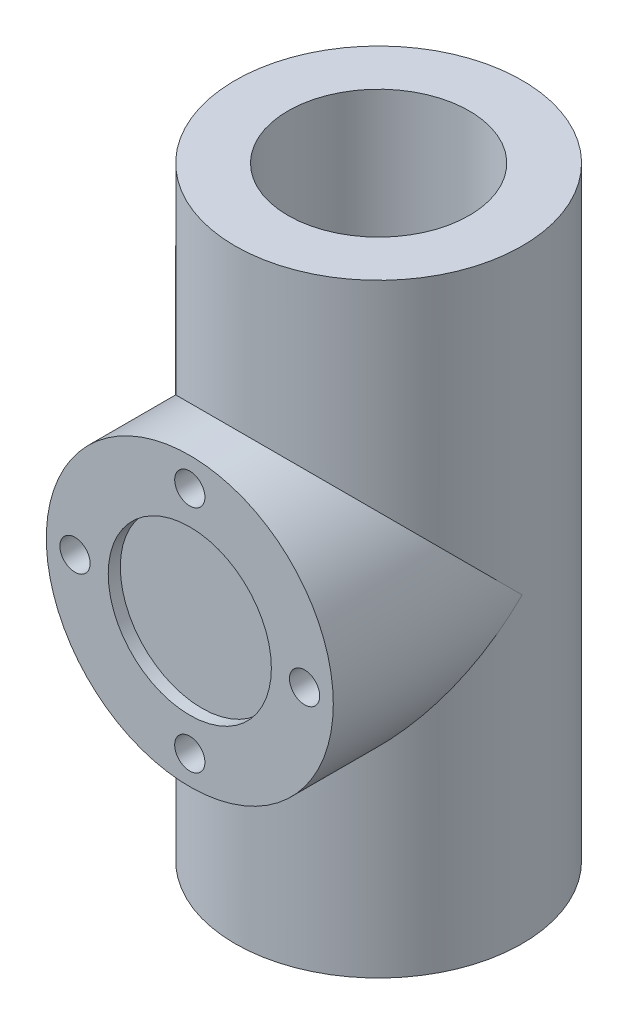
ISO-10303-21;
HEADER;
FILE_DESCRIPTION(('STEP AP214'),'2;1');
FILE_NAME('part.step','',(''),(''),'','','');
FILE_SCHEMA(('AUTOMOTIVE_DESIGN { 1 0 10303 214 1 1 1 1 }'));
ENDSEC;
DATA;
#1=APPLICATION_CONTEXT('core data for automotive mechanical design processes');
#2=APPLICATION_PROTOCOL_DEFINITION('international standard','automotive_design',2000,#1);
#3=PRODUCT_CONTEXT('',#1,'mechanical');
#4=PRODUCT('Part','Part','',(#3));
#5=PRODUCT_RELATED_PRODUCT_CATEGORY('part','',(#4));
#6=PRODUCT_DEFINITION_FORMATION('','',#4);
#7=PRODUCT_DEFINITION_CONTEXT('part definition',#1,'design');
#8=PRODUCT_DEFINITION('design','',#6,#7);
#9=PRODUCT_DEFINITION_SHAPE('','',#8);
#10=(LENGTH_UNIT() NAMED_UNIT(*) SI_UNIT(.MILLI.,.METRE.));
#11=(NAMED_UNIT(*) PLANE_ANGLE_UNIT() SI_UNIT($,.RADIAN.));
#12=(NAMED_UNIT(*) SI_UNIT($,.STERADIAN.) SOLID_ANGLE_UNIT());
#13=UNCERTAINTY_MEASURE_WITH_UNIT(LENGTH_MEASURE(1.E-05),#10,'distance_accuracy_value','');
#14=(GEOMETRIC_REPRESENTATION_CONTEXT(3) GLOBAL_UNCERTAINTY_ASSIGNED_CONTEXT((#13)) GLOBAL_UNIT_ASSIGNED_CONTEXT((#10,
#11,#12)) REPRESENTATION_CONTEXT('',''));
#15=CARTESIAN_POINT('',(0.,0.,0.));
#16=DIRECTION('',(0.,0.,1.));
#17=DIRECTION('',(1.,0.,0.));
#18=AXIS2_PLACEMENT_3D('',#15,#16,#17);
#19=CARTESIAN_POINT('',(0.,200.,0.));
#20=DIRECTION('',(0.,-1.,0.));
#21=DIRECTION('',(0.,0.,-1.));
#22=AXIS2_PLACEMENT_3D('',#19,#20,#21);
#23=CYLINDRICAL_SURFACE('',#22,47.5);
#24=CARTESIAN_POINT('',(0.,0.,0.));
#25=DIRECTION('',(0.,1.,0.));
#26=DIRECTION('',(0.,0.,1.));
#27=AXIS2_PLACEMENT_3D('',#24,#25,#26);
#28=CIRCLE('',#27,47.5);
#29=CARTESIAN_POINT('',(0.,0.,47.5));
#30=VERTEX_POINT('',#29);
#31=EDGE_CURVE('E114',#30,#30,#28,.T.);
#32=ORIENTED_EDGE('',*,*,#31,.T.);
#33=EDGE_LOOP('',(#32));
#34=FACE_BOUND('',#33,.T.);
#35=CARTESIAN_POINT('',(0.,200.,0.));
#36=DIRECTION('',(0.,1.,0.));
#37=DIRECTION('',(0.,0.,1.));
#38=AXIS2_PLACEMENT_3D('',#35,#36,#37);
#39=CIRCLE('',#38,47.5);
#40=CARTESIAN_POINT('',(0.,200.,47.5));
#41=VERTEX_POINT('',#40);
#42=EDGE_CURVE('E91',#41,#41,#39,.T.);
#43=ORIENTED_EDGE('',*,*,#42,.F.);
#44=EDGE_LOOP('',(#43));
#45=FACE_BOUND('',#44,.T.);
#46=CARTESIAN_POINT('',(0.,100.,0.));
#47=DIRECTION('',(0.,-0.707106781186547,-0.707106781186547));
#48=DIRECTION('',(0.,-0.707106781186547,0.707106781186547));
#49=AXIS2_PLACEMENT_3D('',#46,#47,#48);
#50=ELLIPSE('',#49,67.175144212722,47.5);
#51=CARTESIAN_POINT('',(-47.5,100.,0.));
#52=VERTEX_POINT('',#51);
#53=CARTESIAN_POINT('',(47.5,100.,0.));
#54=VERTEX_POINT('',#53);
#55=EDGE_CURVE('E106',#52,#54,#50,.F.);
#56=ORIENTED_EDGE('',*,*,#55,.F.);
#57=CARTESIAN_POINT('',(0.,100.,0.));
#58=DIRECTION('',(0.,-0.707106781186547,0.707106781186547));
#59=DIRECTION('',(0.,-0.707106781186547,-0.707106781186547));
#60=AXIS2_PLACEMENT_3D('',#57,#58,#59);
#61=ELLIPSE('',#60,67.175144212722,47.5);
#62=EDGE_CURVE('E59',#54,#52,#61,.T.);
#63=ORIENTED_EDGE('',*,*,#62,.F.);
#64=EDGE_LOOP('',(#56,#63));
#65=FACE_BOUND('',#64,.T.);
#66=ADVANCED_FACE('F45',(#34,#45,#65),#23,.T.);
#67=CARTESIAN_POINT('',(0.,0.,0.));
#68=DIRECTION('',(0.,1.,0.));
#69=DIRECTION('',(0.,0.,1.));
#70=AXIS2_PLACEMENT_3D('',#67,#68,#69);
#71=CYLINDRICAL_SURFACE('',#70,30.);
#72=CARTESIAN_POINT('',(0.,200.,0.));
#73=DIRECTION('',(0.,1.,0.));
#74=DIRECTION('',(0.,0.,1.));
#75=AXIS2_PLACEMENT_3D('',#72,#73,#74);
#76=CIRCLE('',#75,30.);
#77=CARTESIAN_POINT('',(0.,200.,30.));
#78=VERTEX_POINT('',#77);
#79=EDGE_CURVE('E109',#78,#78,#76,.T.);
#80=ORIENTED_EDGE('',*,*,#79,.T.);
#81=EDGE_LOOP('',(#80));
#82=FACE_BOUND('',#81,.T.);
#83=CARTESIAN_POINT('',(0.,0.,0.));
#84=DIRECTION('',(0.,1.,0.));
#85=DIRECTION('',(0.,0.,1.));
#86=AXIS2_PLACEMENT_3D('',#83,#84,#85);
#87=CIRCLE('',#86,30.);
#88=CARTESIAN_POINT('',(0.,0.,30.));
#89=VERTEX_POINT('',#88);
#90=EDGE_CURVE('E110',#89,#89,#87,.T.);
#91=ORIENTED_EDGE('',*,*,#90,.F.);
#92=EDGE_LOOP('',(#91));
#93=FACE_BOUND('',#92,.T.);
#94=DIRECTION('',(0.,1.,0.));
#95=VECTOR('',#94,1.);
#96=CARTESIAN_POINT('',(30.,0.,0.));
#97=LINE('',#96,#95);
#98=CARTESIAN_POINT('',(30.,136.827299656641,0.));
#99=VERTEX_POINT('',#98);
#100=CARTESIAN_POINT('',(30.,63.1727003433594,0.));
#101=VERTEX_POINT('',#100);
#102=EDGE_CURVE('E11',#99,#101,#97,.F.);
#103=ORIENTED_EDGE('',*,*,#102,.F.);
#104=CARTESIAN_POINT('',(-30.,136.827299656641,0.));
#105=CARTESIAN_POINT('',(-30.0000119505361,136.827276029075,0.374455924265689));
#106=CARTESIAN_POINT('',(-29.9929894167792,136.833010223074,0.748902100394203));
#107=CARTESIAN_POINT('',(-29.9649658109249,136.855819357609,1.49689507312636));
#108=CARTESIAN_POINT('',(-29.9439658929776,136.872893361785,1.87044194143254));
#109=CARTESIAN_POINT('',(-29.8881089002417,136.918182156073,2.61540536332435));
#110=CARTESIAN_POINT('',(-29.8532672133826,136.946384574464,2.98682381949721));
#111=CARTESIAN_POINT('',(-29.7699080744974,137.013584115403,3.72711456215318));
#112=CARTESIAN_POINT('',(-29.7213904358608,137.052581385247,4.09598681382257));
#113=CARTESIAN_POINT('',(-29.5566159927085,137.18435762617,5.19112822135676));
#114=CARTESIAN_POINT('',(-29.4206191807646,137.292349912456,5.91274032343116));
#115=CARTESIAN_POINT('',(-29.0979075091868,137.544686599687,7.33799679821433));
#116=CARTESIAN_POINT('',(-28.9111805261577,137.689039689462,8.0416368319639));
#117=CARTESIAN_POINT('',(-28.4904911173969,138.008041460177,9.42398948803503));
#118=CARTESIAN_POINT('',(-28.2567396693865,138.18255435147,10.1027979870203));
#119=CARTESIAN_POINT('',(-27.7440369659352,138.556699074271,11.4358420870042));
#120=CARTESIAN_POINT('',(-27.4650874649834,138.756329930687,12.090078640618));
#121=CARTESIAN_POINT('',(-26.86359496142,139.175654942823,13.3735084742009));
#122=CARTESIAN_POINT('',(-26.540950253745,139.395395507038,14.0026387565932));
#123=CARTESIAN_POINT('',(-25.8545969732942,139.849204503207,15.2327273399785));
#124=CARTESIAN_POINT('',(-25.4908833795592,140.083274685453,15.8336821835885));
#125=CARTESIAN_POINT('',(-24.6718939671222,140.593236972872,17.0859909275428));
#126=CARTESIAN_POINT('',(-24.2108947361945,140.870482198939,17.7330564517407));
#127=CARTESIAN_POINT('',(-23.2402962883946,141.43009173811,18.987298535083));
#128=CARTESIAN_POINT('',(-22.7306940617067,141.712456367363,19.594472619951));
#129=CARTESIAN_POINT('',(-21.6645628570134,142.276002144136,20.7671572176634));
#130=CARTESIAN_POINT('',(-21.1080182596204,142.557182864795,21.332653744701));
#131=CARTESIAN_POINT('',(-19.9498904695977,143.112229008975,22.4194676985832));
#132=CARTESIAN_POINT('',(-19.3483046382384,143.386094002629,22.9407825332339));
#133=CARTESIAN_POINT('',(-18.0241854662883,143.954069056992,23.9986128959329));
#134=CARTESIAN_POINT('',(-17.2959236765199,144.246446719452,24.5289214411833));
#135=CARTESIAN_POINT('',(-15.7878592025743,144.80670207612,25.5256818476078));
#136=CARTESIAN_POINT('',(-15.0080511401328,145.074577206796,25.9921270297263));
#137=CARTESIAN_POINT('',(-13.4016430294921,145.577997371648,26.8556664697754));
#138=CARTESIAN_POINT('',(-12.5750758510792,145.813564727619,27.2528086621023));
#139=CARTESIAN_POINT('',(-10.8802727084726,146.245365442879,27.9726078063249));
#140=CARTESIAN_POINT('',(-10.0120445642789,146.441606148482,28.2952786713603));
#141=CARTESIAN_POINT('',(-8.33263759957858,146.770417082643,28.8316136771908));
#142=CARTESIAN_POINT('',(-7.52483065638796,146.907470466239,29.0530951330128));
#143=CARTESIAN_POINT('',(-5.88786992749363,147.140918478425,29.4285213210366));
#144=CARTESIAN_POINT('',(-5.0587174795159,147.237315648396,29.5824702746549));
#145=CARTESIAN_POINT('',(-3.38726959672532,147.386493738263,29.8200995590151));
#146=CARTESIAN_POINT('',(-2.54498669049384,147.439313918636,29.9038431420466));
#147=CARTESIAN_POINT('',(-0.854775674508137,147.499832991023,29.9997595536206));
#148=CARTESIAN_POINT('',(-0.00684824786985989,147.507537247164,30.011940890665));
#149=CARTESIAN_POINT('',(1.56993735853998,147.479672869905,29.967806832471));
#150=CARTESIAN_POINT('',(2.29917704515809,147.449893913052,29.9206561848193));
#151=CARTESIAN_POINT('',(3.75013027960727,147.357309826574,29.7736138996731));
#152=CARTESIAN_POINT('',(4.47184468255744,147.294508492018,29.673728322692));
#153=CARTESIAN_POINT('',(5.90276085397428,147.137305850752,29.4225284118384));
#154=CARTESIAN_POINT('',(6.61196207422511,147.042903163154,29.2712118305751));
#155=CARTESIAN_POINT('',(8.01329208136874,146.824566925747,28.9190102079168));
#156=CARTESIAN_POINT('',(8.70542014409619,146.700632125689,28.718123067928));
#157=CARTESIAN_POINT('',(10.0696600980455,146.425606729266,28.2686856101297));
#158=CARTESIAN_POINT('',(10.7417392936795,146.274474329888,28.0200618807157));
#159=CARTESIAN_POINT('',(12.0614034704887,145.948172997522,27.4778360981808));
#160=CARTESIAN_POINT('',(12.7089887703547,145.773004377407,27.1842346305181));
#161=CARTESIAN_POINT('',(13.9769674841142,145.401881083379,26.5545757283601));
#162=CARTESIAN_POINT('',(14.5973599950385,145.205925719955,26.2185168854528));
#163=CARTESIAN_POINT('',(15.8087606951709,144.796673267987,25.5064077117228));
#164=CARTESIAN_POINT('',(16.3997670008732,144.583375070158,25.1303548223224));
#165=CARTESIAN_POINT('',(17.622863641624,144.115365416145,24.2909793727877));
#166=CARTESIAN_POINT('',(18.2508026951947,143.858815963748,23.8226273183818));
#167=CARTESIAN_POINT('',(19.4651764963998,143.333528388463,22.8411157123451));
#168=CARTESIAN_POINT('',(20.0516083129604,143.064789406993,22.3279530020705));
#169=CARTESIAN_POINT('',(21.1822130640733,142.520092293833,21.2584207459874));
#170=CARTESIAN_POINT('',(21.7263099638251,142.24412231116,20.7019768927212));
#171=CARTESIAN_POINT('',(22.7694566767168,141.691131015948,19.5488212494165));
#172=CARTESIAN_POINT('',(23.2685039670573,141.414109645436,18.9521072074946));
#173=CARTESIAN_POINT('',(24.2843395271615,140.827805387426,17.6366645386531));
#174=CARTESIAN_POINT('',(24.7943553200839,140.519242255829,16.912363404257));
#175=CARTESIAN_POINT('',(25.7510679070926,139.918063708826,15.4165739552301));
#176=CARTESIAN_POINT('',(26.1977542651443,139.62545092675,14.6450778932802));
#177=CARTESIAN_POINT('',(27.0225206625751,139.067638601213,13.0605595681603));
#178=CARTESIAN_POINT('',(27.4008420676808,138.802344095776,12.2476969217762));
#179=CARTESIAN_POINT('',(28.0863044115177,138.309111444472,10.5815951391151));
#180=CARTESIAN_POINT('',(28.3934665050023,138.081162202252,9.72836809372554));
#181=CARTESIAN_POINT('',(28.8793612528174,137.713478063024,8.15610478024935));
#182=CARTESIAN_POINT('',(29.0714499320864,137.565208710387,7.44317034522345));
#183=CARTESIAN_POINT('',(29.4034787699013,137.305898621345,5.99865668177356));
#184=CARTESIAN_POINT('',(29.5434396612361,137.194843085651,5.2670849899039));
#185=CARTESIAN_POINT('',(29.713059747541,137.059266140165,4.15647971060946));
#186=CARTESIAN_POINT('',(29.7630163610921,137.019128350749,3.78229830500615));
#187=CARTESIAN_POINT('',(29.8488548571779,136.949951742714,3.0312771043472));
#188=CARTESIAN_POINT('',(29.8847369756738,136.920912738022,2.65443735396699));
#189=CARTESIAN_POINT('',(29.9422720585262,136.874269965205,1.89847272477694));
#190=CARTESIAN_POINT('',(29.9639063133731,136.856681233294,1.51934549844234));
#191=CARTESIAN_POINT('',(29.992777255665,136.833183032188,0.760149059359162));
#192=CARTESIAN_POINT('',(30.0000126501137,136.827274611867,0.380079765082351));
#193=CARTESIAN_POINT('',(30.,136.827299656641,0.));
#194=B_SPLINE_CURVE_WITH_KNOTS('',3,(#104,#105,#106,#107,#108,#109,#110,#111,#112,#113,#114,
#115,#116,#117,#118,#119,#120,#121,#122,#123,#124,#125,#126,#127,#128,#129,#130,#131,#132,#133,
#134,#135,#136,#137,#138,#139,#140,#141,#142,#143,#144,#145,#146,#147,#148,#149,#150,#151,#152,
#153,#154,#155,#156,#157,#158,#159,#160,#161,#162,#163,#164,#165,#166,#167,#168,#169,#170,#171,
#172,#173,#174,#175,#176,#177,#178,#179,#180,#181,#182,#183,#184,#185,#186,#187,#188,#189,#190,
#191,#192,#193),.UNSPECIFIED.,.F.,.F.,(4,2,2,2,2,2,2,2,2,2,2,2,2,2,2,2,2,2,2,2,2,2,2,2,2,2,2,2,
2,2,2,2,2,2,2,2,2,2,2,2,2,2,2,2,4),(0.,1.12324121172139,2.24638968590682,3.36829303150502,
4.49021168638552,6.71357456931194,8.93746925515807,11.1516003377524,13.365645493232,
15.5849355942859,17.8044973134888,20.3264563881367,22.8485717405344,25.3715296257338,
27.8946354336298,30.7322849868108,33.5702310850615,36.4062064296769,39.2416515122412,
41.7841880382191,44.3265656090967,46.8666501281253,49.4064326338383,51.5979013854583,
53.7891183393496,55.9804310556004,58.1718365580634,60.36663949888,62.5614138732057,
64.7562610725337,66.9512487694982,69.4216834795099,71.8922924679781,74.3672409563012,
76.8423279570346,79.653078665542,82.4642920196055,85.2653776094674,88.0656294007364,
90.3223083198245,92.5780887289253,93.7166198438439,94.8551318702851,95.9951359627342,
97.1352424212329),.UNSPECIFIED.);
#195=CARTESIAN_POINT('',(-30.,136.827299656641,0.));
#196=VERTEX_POINT('',#195);
#197=EDGE_CURVE('E53',#196,#99,#194,.T.);
#198=ORIENTED_EDGE('',*,*,#197,.F.);
#199=DIRECTION('',(0.,1.,0.));
#200=VECTOR('',#199,1.);
#201=CARTESIAN_POINT('',(-30.,0.,0.));
#202=LINE('',#201,#200);
#203=CARTESIAN_POINT('',(-30.,63.1727003433594,0.));
#204=VERTEX_POINT('',#203);
#205=EDGE_CURVE('E77',#204,#196,#202,.T.);
#206=ORIENTED_EDGE('',*,*,#205,.F.);
#207=CARTESIAN_POINT('',(30.,63.1727003433594,0.));
#208=CARTESIAN_POINT('',(30.0000119505361,63.1727239709255,0.37445592426569));
#209=CARTESIAN_POINT('',(29.9929894167792,63.1669897769261,0.748902100394203));
#210=CARTESIAN_POINT('',(29.9649658109249,63.1441806423915,1.49689507312636));
#211=CARTESIAN_POINT('',(29.9439658929776,63.1271066382151,1.87044194143253));
#212=CARTESIAN_POINT('',(29.8881089002417,63.0818178439268,2.61540536332435));
#213=CARTESIAN_POINT('',(29.8532672133826,63.0536154255357,2.98682381949722));
#214=CARTESIAN_POINT('',(29.7699080744974,62.9864158845975,3.72711456215319));
#215=CARTESIAN_POINT('',(29.7213904358608,62.9474186147533,4.09598681382258));
#216=CARTESIAN_POINT('',(29.5566159927085,62.81564237383,5.19112822135676));
#217=CARTESIAN_POINT('',(29.4206191807646,62.7076500875437,5.91274032343116));
#218=CARTESIAN_POINT('',(29.0979075091868,62.4553134003132,7.33799679821433));
#219=CARTESIAN_POINT('',(28.9111805261577,62.3109603105382,8.0416368319639));
#220=CARTESIAN_POINT('',(28.4904911173969,61.9919585398235,9.42398948803503));
#221=CARTESIAN_POINT('',(28.2567396693865,61.8174456485302,10.1027979870203));
#222=CARTESIAN_POINT('',(27.7440369659352,61.4433009257291,11.4358420870042));
#223=CARTESIAN_POINT('',(27.4650874649834,61.2436700693126,12.090078640618));
#224=CARTESIAN_POINT('',(26.86359496142,60.8243450571768,13.3735084742008));
#225=CARTESIAN_POINT('',(26.540950253745,60.604604492962,14.0026387565932));
#226=CARTESIAN_POINT('',(25.8545969732942,60.1507954967927,15.2327273399785));
#227=CARTESIAN_POINT('',(25.4908833795592,59.9167253145471,15.8336821835885));
#228=CARTESIAN_POINT('',(24.6718939671222,59.4067630271281,17.0859909275428));
#229=CARTESIAN_POINT('',(24.2108947361945,59.1295178010612,17.7330564517407));
#230=CARTESIAN_POINT('',(23.2402962883946,58.5699082618901,18.987298535083));
#231=CARTESIAN_POINT('',(22.7306940617067,58.2875436326371,19.594472619951));
#232=CARTESIAN_POINT('',(21.6645628570134,57.7239978558637,20.7671572176634));
#233=CARTESIAN_POINT('',(21.1080182596204,57.4428171352053,21.332653744701));
#234=CARTESIAN_POINT('',(19.9498904695977,56.8877709910252,22.4194676985832));
#235=CARTESIAN_POINT('',(19.3483046382384,56.6139059973709,22.940782533234));
#236=CARTESIAN_POINT('',(18.0241854662883,56.0459309430083,23.9986128959329));
#237=CARTESIAN_POINT('',(17.2959236765199,55.7535532805479,24.5289214411833));
#238=CARTESIAN_POINT('',(15.7878592025743,55.1932979238796,25.5256818476078));
#239=CARTESIAN_POINT('',(15.0080511401328,54.9254227932038,25.9921270297263));
#240=CARTESIAN_POINT('',(13.4016430294921,54.4220026283525,26.8556664697754));
#241=CARTESIAN_POINT('',(12.5750758510792,54.1864352723808,27.2528086621023));
#242=CARTESIAN_POINT('',(10.8802727084726,53.7546345571213,27.9726078063249));
#243=CARTESIAN_POINT('',(10.0120445642789,53.558393851518,28.2952786713603));
#244=CARTESIAN_POINT('',(8.33263759957859,53.2295829173574,28.8316136771908));
#245=CARTESIAN_POINT('',(7.52483065638797,53.0925295337614,29.0530951330128));
#246=CARTESIAN_POINT('',(5.88786992749364,52.8590815215752,29.4285213210366));
#247=CARTESIAN_POINT('',(5.05871747951591,52.7626843516037,29.5824702746549));
#248=CARTESIAN_POINT('',(3.38726959672532,52.6135062617366,29.8200995590151));
#249=CARTESIAN_POINT('',(2.54498669049384,52.5606860813638,29.9038431420466));
#250=CARTESIAN_POINT('',(0.854775674508138,52.5001670089767,29.9997595536206));
#251=CARTESIAN_POINT('',(0.00684824786986097,52.4924627528364,30.011940890665));
#252=CARTESIAN_POINT('',(-1.56993735853998,52.520327130095,29.967806832471));
#253=CARTESIAN_POINT('',(-2.29917704515809,52.5501060869479,29.9206561848193));
#254=CARTESIAN_POINT('',(-3.75013027960727,52.6426901734265,29.7736138996731));
#255=CARTESIAN_POINT('',(-4.47184468255744,52.7054915079824,29.673728322692));
#256=CARTESIAN_POINT('',(-5.90276085397428,52.8626941492481,29.4225284118384));
#257=CARTESIAN_POINT('',(-6.61196207422511,52.9570968368459,29.2712118305751));
#258=CARTESIAN_POINT('',(-8.01329208136874,53.1754330742529,28.9190102079168));
#259=CARTESIAN_POINT('',(-8.7054201440962,53.2993678743109,28.718123067928));
#260=CARTESIAN_POINT('',(-10.0696600980455,53.5743932707337,28.2686856101297));
#261=CARTESIAN_POINT('',(-10.7417392936795,53.7255256701119,28.0200618807157));
#262=CARTESIAN_POINT('',(-12.0614034704887,54.0518270024784,27.4778360981808));
#263=CARTESIAN_POINT('',(-12.7089887703547,54.2269956225932,27.1842346305181));
#264=CARTESIAN_POINT('',(-13.9769674841142,54.5981189166209,26.5545757283601));
#265=CARTESIAN_POINT('',(-14.5973599950385,54.7940742800447,26.2185168854528));
#266=CARTESIAN_POINT('',(-15.8087606951709,55.2033267320133,25.5064077117228));
#267=CARTESIAN_POINT('',(-16.3997670008732,55.4166249298423,25.1303548223224));
#268=CARTESIAN_POINT('',(-17.622863641624,55.8846345838554,24.2909793727877));
#269=CARTESIAN_POINT('',(-18.2508026951947,56.1411840362523,23.8226273183818));
#270=CARTESIAN_POINT('',(-19.4651764963998,56.6664716115375,22.8411157123451));
#271=CARTESIAN_POINT('',(-20.0516083129604,56.9352105930068,22.3279530020705));
#272=CARTESIAN_POINT('',(-21.1822130640733,57.4799077061673,21.2584207459874));
#273=CARTESIAN_POINT('',(-21.7263099638251,57.7558776888404,20.7019768927212));
#274=CARTESIAN_POINT('',(-22.7694566767168,58.3088689840517,19.5488212494165));
#275=CARTESIAN_POINT('',(-23.2685039670573,58.585890354564,18.9521072074946));
#276=CARTESIAN_POINT('',(-24.2843395271615,59.1721946125744,17.6366645386531));
#277=CARTESIAN_POINT('',(-24.794355320084,59.4807577441707,16.912363404257));
#278=CARTESIAN_POINT('',(-25.7510679070926,60.081936291174,15.4165739552301));
#279=CARTESIAN_POINT('',(-26.1977542651443,60.3745490732499,14.6450778932801));
#280=CARTESIAN_POINT('',(-27.0225206625752,60.9323613987875,13.0605595681603));
#281=CARTESIAN_POINT('',(-27.4008420676808,61.1976559042241,12.2476969217762));
#282=CARTESIAN_POINT('',(-28.0863044115177,61.6908885555279,10.5815951391151));
#283=CARTESIAN_POINT('',(-28.3934665050023,61.9188377977483,9.72836809372553));
#284=CARTESIAN_POINT('',(-28.8793612528174,62.2865219369759,8.15610478024934));
#285=CARTESIAN_POINT('',(-29.0714499320864,62.4347912896128,7.44317034522344));
#286=CARTESIAN_POINT('',(-29.4034787699013,62.6941013786554,5.99865668177356));
#287=CARTESIAN_POINT('',(-29.5434396612361,62.8051569143489,5.2670849899039));
#288=CARTESIAN_POINT('',(-29.713059747541,62.9407338598349,4.15647971060946));
#289=CARTESIAN_POINT('',(-29.7630163610921,62.9808716492508,3.78229830500615));
#290=CARTESIAN_POINT('',(-29.8488548571779,63.0500482572858,3.0312771043472));
#291=CARTESIAN_POINT('',(-29.8847369756738,63.0790872619776,2.65443735396699));
#292=CARTESIAN_POINT('',(-29.9422720585262,63.1257300347949,1.89847272477694));
#293=CARTESIAN_POINT('',(-29.9639063133731,63.1433187667058,1.51934549844234));
#294=CARTESIAN_POINT('',(-29.992777255665,63.1668169678125,0.760149059359163));
#295=CARTESIAN_POINT('',(-30.0000126501137,63.1727253881334,0.380079765082351));
#296=CARTESIAN_POINT('',(-30.,63.1727003433594,0.));
#297=B_SPLINE_CURVE_WITH_KNOTS('',3,(#207,#208,#209,#210,#211,#212,#213,#214,#215,#216,#217,
#218,#219,#220,#221,#222,#223,#224,#225,#226,#227,#228,#229,#230,#231,#232,#233,#234,#235,#236,
#237,#238,#239,#240,#241,#242,#243,#244,#245,#246,#247,#248,#249,#250,#251,#252,#253,#254,#255,
#256,#257,#258,#259,#260,#261,#262,#263,#264,#265,#266,#267,#268,#269,#270,#271,#272,#273,#274,
#275,#276,#277,#278,#279,#280,#281,#282,#283,#284,#285,#286,#287,#288,#289,#290,#291,#292,#293,
#294,#295,#296),.UNSPECIFIED.,.F.,.F.,(4,2,2,2,2,2,2,2,2,2,2,2,2,2,2,2,2,2,2,2,2,2,2,2,2,2,2,2,
2,2,2,2,2,2,2,2,2,2,2,2,2,2,2,2,4),(0.,1.12324121172139,2.24638968590682,3.36829303150502,
4.49021168638552,6.71357456931194,8.93746925515807,11.1516003377524,13.365645493232,
15.5849355942859,17.8044973134888,20.3264563881367,22.8485717405344,25.3715296257338,
27.8946354336298,30.7322849868108,33.5702310850614,36.4062064296769,39.2416515122412,
41.7841880382191,44.3265656090967,46.8666501281253,49.4064326338383,51.5979013854583,
53.7891183393496,55.9804310556004,58.1718365580634,60.36663949888,62.5614138732057,
64.7562610725337,66.9512487694982,69.42168347951,71.8922924679781,74.3672409563012,
76.8423279570346,79.6530786655421,82.4642920196055,85.2653776094675,88.0656294007364,
90.3223083198245,92.5780887289253,93.7166198438439,94.8551318702851,95.9951359627342,
97.1352424212329),.UNSPECIFIED.);
#298=EDGE_CURVE('E83',#101,#204,#297,.T.);
#299=ORIENTED_EDGE('',*,*,#298,.F.);
#300=EDGE_LOOP('',(#103,#198,#206,#299));
#301=FACE_BOUND('',#300,.T.);
#302=ADVANCED_FACE('F76',(#82,#93,#301),#71,.F.);
#303=CARTESIAN_POINT('',(0.,200.,0.));
#304=DIRECTION('',(0.,1.,0.));
#305=DIRECTION('',(0.,0.,1.));
#306=AXIS2_PLACEMENT_3D('',#303,#304,#305);
#307=PLANE('',#306);
#308=ORIENTED_EDGE('',*,*,#79,.F.);
#309=EDGE_LOOP('',(#308));
#310=FACE_BOUND('',#309,.T.);
#311=ORIENTED_EDGE('',*,*,#42,.T.);
#312=EDGE_LOOP('',(#311));
#313=FACE_BOUND('',#312,.T.);
#314=ADVANCED_FACE('F199',(#310,#313),#307,.T.);
#315=CARTESIAN_POINT('',(0.,0.,0.));
#316=DIRECTION('',(0.,1.,0.));
#317=DIRECTION('',(0.,0.,1.));
#318=AXIS2_PLACEMENT_3D('',#315,#316,#317);
#319=PLANE('',#318);
#320=ORIENTED_EDGE('',*,*,#90,.T.);
#321=EDGE_LOOP('',(#320));
#322=FACE_BOUND('',#321,.T.);
#323=ORIENTED_EDGE('',*,*,#31,.F.);
#324=EDGE_LOOP('',(#323));
#325=FACE_BOUND('',#324,.T.);
#326=ADVANCED_FACE('F147',(#322,#325),#319,.F.);
#327=CARTESIAN_POINT('',(0.,100.,0.));
#328=DIRECTION('',(0.,0.,1.));
#329=DIRECTION('',(1.,0.,0.));
#330=AXIS2_PLACEMENT_3D('',#327,#328,#329);
#331=PLANE('',#330);
#332=CARTESIAN_POINT('',(0.,100.,0.));
#333=DIRECTION('',(0.,0.,1.));
#334=DIRECTION('',(1.,0.,0.));
#335=AXIS2_PLACEMENT_3D('',#332,#333,#334);
#336=CIRCLE('',#335,47.5);
#337=EDGE_CURVE('E87',#99,#196,#336,.T.);
#338=ORIENTED_EDGE('',*,*,#337,.F.);
#339=ORIENTED_EDGE('',*,*,#102,.T.);
#340=EDGE_CURVE('E89',#204,#101,#336,.T.);
#341=ORIENTED_EDGE('',*,*,#340,.F.);
#342=ORIENTED_EDGE('',*,*,#205,.T.);
#343=EDGE_LOOP('',(#338,#339,#341,#342));
#344=FACE_BOUND('',#343,.T.);
#345=ADVANCED_FACE('F86',(#344),#331,.F.);
#346=CARTESIAN_POINT('',(0.,100.,62.5));
#347=DIRECTION('',(0.,0.,-1.));
#348=DIRECTION('',(-1.,0.,0.));
#349=AXIS2_PLACEMENT_3D('',#346,#347,#348);
#350=CYLINDRICAL_SURFACE('',#349,47.5);
#351=ORIENTED_EDGE('',*,*,#340,.T.);
#352=ORIENTED_EDGE('',*,*,#298,.T.);
#353=EDGE_LOOP('',(#351,#352));
#354=FACE_BOUND('',#353,.T.);
#355=ADVANCED_FACE('F143',(#354),#350,.T.);
#356=ORIENTED_EDGE('',*,*,#337,.T.);
#357=ORIENTED_EDGE('',*,*,#197,.T.);
#358=EDGE_LOOP('',(#356,#357));
#359=FACE_BOUND('',#358,.T.);
#360=ADVANCED_FACE('F93',(#359),#350,.T.);
#361=CARTESIAN_POINT('',(0.,100.,62.5));
#362=DIRECTION('',(0.,0.,1.));
#363=DIRECTION('',(1.,0.,0.));
#364=AXIS2_PLACEMENT_3D('',#361,#362,#363);
#365=CIRCLE('',#364,47.5);
#366=CARTESIAN_POINT('',(47.5,100.,62.5));
#367=VERTEX_POINT('',#366);
#368=EDGE_CURVE('E95',#367,#367,#365,.T.);
#369=ORIENTED_EDGE('',*,*,#368,.F.);
#370=EDGE_LOOP('',(#369));
#371=FACE_BOUND('',#370,.T.);
#372=ORIENTED_EDGE('',*,*,#62,.T.);
#373=ORIENTED_EDGE('',*,*,#55,.T.);
#374=EDGE_LOOP('',(#372,#373));
#375=FACE_BOUND('',#374,.T.);
#376=ADVANCED_FACE('F137',(#371,#375),#350,.T.);
#377=CARTESIAN_POINT('',(0.,100.,62.5));
#378=DIRECTION('',(0.,0.,1.));
#379=DIRECTION('',(1.,0.,0.));
#380=AXIS2_PLACEMENT_3D('',#377,#378,#379);
#381=PLANE('',#380);
#382=CARTESIAN_POINT('',(0.,100.,62.5));
#383=DIRECTION('',(0.,0.,1.));
#384=DIRECTION('',(1.,0.,0.));
#385=AXIS2_PLACEMENT_3D('',#382,#383,#384);
#386=CIRCLE('',#385,27.);
#387=CARTESIAN_POINT('',(27.,100.,62.5));
#388=VERTEX_POINT('',#387);
#389=EDGE_CURVE('E330',#388,#388,#386,.T.);
#390=ORIENTED_EDGE('',*,*,#389,.F.);
#391=EDGE_LOOP('',(#390));
#392=FACE_BOUND('',#391,.T.);
#393=CARTESIAN_POINT('',(0.,138.,62.5));
#394=DIRECTION('',(0.,0.,1.));
#395=DIRECTION('',(1.,0.,0.));
#396=AXIS2_PLACEMENT_3D('',#393,#394,#395);
#397=CIRCLE('',#396,5.);
#398=CARTESIAN_POINT('',(5.,138.,62.5));
#399=VERTEX_POINT('',#398);
#400=EDGE_CURVE('E342',#399,#399,#397,.T.);
#401=ORIENTED_EDGE('',*,*,#400,.F.);
#402=EDGE_LOOP('',(#401));
#403=FACE_BOUND('',#402,.T.);
#404=CARTESIAN_POINT('',(0.,62.,62.5));
#405=DIRECTION('',(0.,0.,1.));
#406=DIRECTION('',(1.,0.,0.));
#407=AXIS2_PLACEMENT_3D('',#404,#405,#406);
#408=CIRCLE('',#407,5.);
#409=CARTESIAN_POINT('',(5.,62.,62.5));
#410=VERTEX_POINT('',#409);
#411=EDGE_CURVE('E346',#410,#410,#408,.T.);
#412=ORIENTED_EDGE('',*,*,#411,.F.);
#413=EDGE_LOOP('',(#412));
#414=FACE_BOUND('',#413,.T.);
#415=CARTESIAN_POINT('',(38.,100.,62.5));
#416=DIRECTION('',(0.,0.,1.));
#417=DIRECTION('',(1.,0.,0.));
#418=AXIS2_PLACEMENT_3D('',#415,#416,#417);
#419=CIRCLE('',#418,5.);
#420=CARTESIAN_POINT('',(43.,100.,62.5));
#421=VERTEX_POINT('',#420);
#422=EDGE_CURVE('E354',#421,#421,#419,.T.);
#423=ORIENTED_EDGE('',*,*,#422,.F.);
#424=EDGE_LOOP('',(#423));
#425=FACE_BOUND('',#424,.T.);
#426=CARTESIAN_POINT('',(-38.,100.,62.5));
#427=DIRECTION('',(0.,0.,1.));
#428=DIRECTION('',(1.,0.,0.));
#429=AXIS2_PLACEMENT_3D('',#426,#427,#428);
#430=CIRCLE('',#429,5.);
#431=CARTESIAN_POINT('',(-33.,100.,62.5));
#432=VERTEX_POINT('',#431);
#433=EDGE_CURVE('E335',#432,#432,#430,.T.);
#434=ORIENTED_EDGE('',*,*,#433,.F.);
#435=EDGE_LOOP('',(#434));
#436=FACE_BOUND('',#435,.T.);
#437=ORIENTED_EDGE('',*,*,#368,.T.);
#438=EDGE_LOOP('',(#437));
#439=FACE_BOUND('',#438,.T.);
#440=ADVANCED_FACE('F141',(#392,#403,#414,#425,#436,#439),#381,.T.);
#441=CARTESIAN_POINT('',(-38.,100.,42.5));
#442=DIRECTION('',(0.,0.,1.));
#443=DIRECTION('',(1.,0.,0.));
#444=AXIS2_PLACEMENT_3D('',#441,#442,#443);
#445=CYLINDRICAL_SURFACE('',#444,5.);
#446=CARTESIAN_POINT('',(-38.,100.,42.5));
#447=DIRECTION('',(0.,0.,1.));
#448=DIRECTION('',(1.,0.,0.));
#449=AXIS2_PLACEMENT_3D('',#446,#447,#448);
#450=CIRCLE('',#449,5.);
#451=CARTESIAN_POINT('',(-33.,100.,42.5));
#452=VERTEX_POINT('',#451);
#453=EDGE_CURVE('E329',#452,#452,#450,.T.);
#454=ORIENTED_EDGE('',*,*,#453,.F.);
#455=EDGE_LOOP('',(#454));
#456=FACE_BOUND('',#455,.T.);
#457=ORIENTED_EDGE('',*,*,#433,.T.);
#458=EDGE_LOOP('',(#457));
#459=FACE_BOUND('',#458,.T.);
#460=ADVANCED_FACE('F150',(#456,#459),#445,.F.);
#461=CARTESIAN_POINT('',(-38.,100.,42.5));
#462=DIRECTION('',(0.,0.,1.));
#463=DIRECTION('',(1.,0.,0.));
#464=AXIS2_PLACEMENT_3D('',#461,#462,#463);
#465=PLANE('',#464);
#466=ORIENTED_EDGE('',*,*,#453,.T.);
#467=EDGE_LOOP('',(#466));
#468=FACE_BOUND('',#467,.T.);
#469=ADVANCED_FACE('F152',(#468),#465,.T.);
#470=CARTESIAN_POINT('',(38.,100.,42.5));
#471=DIRECTION('',(0.,0.,1.));
#472=DIRECTION('',(1.,0.,0.));
#473=AXIS2_PLACEMENT_3D('',#470,#471,#472);
#474=CYLINDRICAL_SURFACE('',#473,5.);
#475=CARTESIAN_POINT('',(38.,100.,42.5));
#476=DIRECTION('',(0.,0.,1.));
#477=DIRECTION('',(1.,0.,0.));
#478=AXIS2_PLACEMENT_3D('',#475,#476,#477);
#479=CIRCLE('',#478,5.);
#480=CARTESIAN_POINT('',(43.,100.,42.5));
#481=VERTEX_POINT('',#480);
#482=EDGE_CURVE('E358',#481,#481,#479,.T.);
#483=ORIENTED_EDGE('',*,*,#482,.F.);
#484=EDGE_LOOP('',(#483));
#485=FACE_BOUND('',#484,.T.);
#486=ORIENTED_EDGE('',*,*,#422,.T.);
#487=EDGE_LOOP('',(#486));
#488=FACE_BOUND('',#487,.T.);
#489=ADVANCED_FACE('F155',(#485,#488),#474,.F.);
#490=CARTESIAN_POINT('',(38.,100.,42.5));
#491=DIRECTION('',(0.,0.,1.));
#492=DIRECTION('',(1.,0.,0.));
#493=AXIS2_PLACEMENT_3D('',#490,#491,#492);
#494=PLANE('',#493);
#495=ORIENTED_EDGE('',*,*,#482,.T.);
#496=EDGE_LOOP('',(#495));
#497=FACE_BOUND('',#496,.T.);
#498=ADVANCED_FACE('F160',(#497),#494,.T.);
#499=CARTESIAN_POINT('',(0.,62.,42.5));
#500=DIRECTION('',(0.,0.,1.));
#501=DIRECTION('',(1.,0.,0.));
#502=AXIS2_PLACEMENT_3D('',#499,#500,#501);
#503=CYLINDRICAL_SURFACE('',#502,5.);
#504=CARTESIAN_POINT('',(0.,62.,42.5));
#505=DIRECTION('',(0.,0.,1.));
#506=DIRECTION('',(1.,0.,0.));
#507=AXIS2_PLACEMENT_3D('',#504,#505,#506);
#508=CIRCLE('',#507,5.);
#509=CARTESIAN_POINT('',(5.,62.,42.5));
#510=VERTEX_POINT('',#509);
#511=EDGE_CURVE('E350',#510,#510,#508,.T.);
#512=ORIENTED_EDGE('',*,*,#511,.F.);
#513=EDGE_LOOP('',(#512));
#514=FACE_BOUND('',#513,.T.);
#515=ORIENTED_EDGE('',*,*,#411,.T.);
#516=EDGE_LOOP('',(#515));
#517=FACE_BOUND('',#516,.T.);
#518=ADVANCED_FACE('F163',(#514,#517),#503,.F.);
#519=CARTESIAN_POINT('',(0.,62.,42.5));
#520=DIRECTION('',(0.,0.,1.));
#521=DIRECTION('',(1.,0.,0.));
#522=AXIS2_PLACEMENT_3D('',#519,#520,#521);
#523=PLANE('',#522);
#524=ORIENTED_EDGE('',*,*,#511,.T.);
#525=EDGE_LOOP('',(#524));
#526=FACE_BOUND('',#525,.T.);
#527=ADVANCED_FACE('F168',(#526),#523,.T.);
#528=CARTESIAN_POINT('',(0.,138.,42.5));
#529=DIRECTION('',(0.,0.,1.));
#530=DIRECTION('',(1.,0.,0.));
#531=AXIS2_PLACEMENT_3D('',#528,#529,#530);
#532=CYLINDRICAL_SURFACE('',#531,5.);
#533=CARTESIAN_POINT('',(0.,138.,42.5));
#534=DIRECTION('',(0.,0.,1.));
#535=DIRECTION('',(1.,0.,0.));
#536=AXIS2_PLACEMENT_3D('',#533,#534,#535);
#537=CIRCLE('',#536,5.);
#538=CARTESIAN_POINT('',(5.,138.,42.5));
#539=VERTEX_POINT('',#538);
#540=EDGE_CURVE('E101',#539,#539,#537,.T.);
#541=ORIENTED_EDGE('',*,*,#540,.F.);
#542=EDGE_LOOP('',(#541));
#543=FACE_BOUND('',#542,.T.);
#544=ORIENTED_EDGE('',*,*,#400,.T.);
#545=EDGE_LOOP('',(#544));
#546=FACE_BOUND('',#545,.T.);
#547=ADVANCED_FACE('F171',(#543,#546),#532,.F.);
#548=CARTESIAN_POINT('',(0.,138.,42.5));
#549=DIRECTION('',(0.,0.,1.));
#550=DIRECTION('',(1.,0.,0.));
#551=AXIS2_PLACEMENT_3D('',#548,#549,#550);
#552=PLANE('',#551);
#553=ORIENTED_EDGE('',*,*,#540,.T.);
#554=EDGE_LOOP('',(#553));
#555=FACE_BOUND('',#554,.T.);
#556=ADVANCED_FACE('F178',(#555),#552,.T.);
#557=CARTESIAN_POINT('',(0.,100.,58.5));
#558=DIRECTION('',(0.,0.,1.));
#559=DIRECTION('',(1.,0.,0.));
#560=AXIS2_PLACEMENT_3D('',#557,#558,#559);
#561=CYLINDRICAL_SURFACE('',#560,27.);
#562=CARTESIAN_POINT('',(0.,100.,58.5));
#563=DIRECTION('',(0.,0.,1.));
#564=DIRECTION('',(1.,0.,0.));
#565=AXIS2_PLACEMENT_3D('',#562,#563,#564);
#566=CIRCLE('',#565,27.);
#567=CARTESIAN_POINT('',(27.,100.,58.5));
#568=VERTEX_POINT('',#567);
#569=EDGE_CURVE('E327',#568,#568,#566,.T.);
#570=ORIENTED_EDGE('',*,*,#569,.F.);
#571=EDGE_LOOP('',(#570));
#572=FACE_BOUND('',#571,.T.);
#573=ORIENTED_EDGE('',*,*,#389,.T.);
#574=EDGE_LOOP('',(#573));
#575=FACE_BOUND('',#574,.T.);
#576=ADVANCED_FACE('F182',(#572,#575),#561,.F.);
#577=CARTESIAN_POINT('',(0.,100.,58.5));
#578=DIRECTION('',(0.,0.,1.));
#579=DIRECTION('',(1.,0.,0.));
#580=AXIS2_PLACEMENT_3D('',#577,#578,#579);
#581=PLANE('',#580);
#582=ORIENTED_EDGE('',*,*,#569,.T.);
#583=EDGE_LOOP('',(#582));
#584=FACE_BOUND('',#583,.T.);
#585=ADVANCED_FACE('F186',(#584),#581,.T.);
#586=CLOSED_SHELL('',(#66,#302,#314,#326,#345,#355,#360,#376,#440,#460,#469,#489,#498,#518,#527,
#547,#556,#576,#585));
#587=MANIFOLD_SOLID_BREP('B2',#586);
#588=ADVANCED_BREP_SHAPE_REPRESENTATION('',(#18,#587),#14);
#589=SHAPE_DEFINITION_REPRESENTATION(#9,#588);
ENDSEC;
END-ISO-10303-21;
